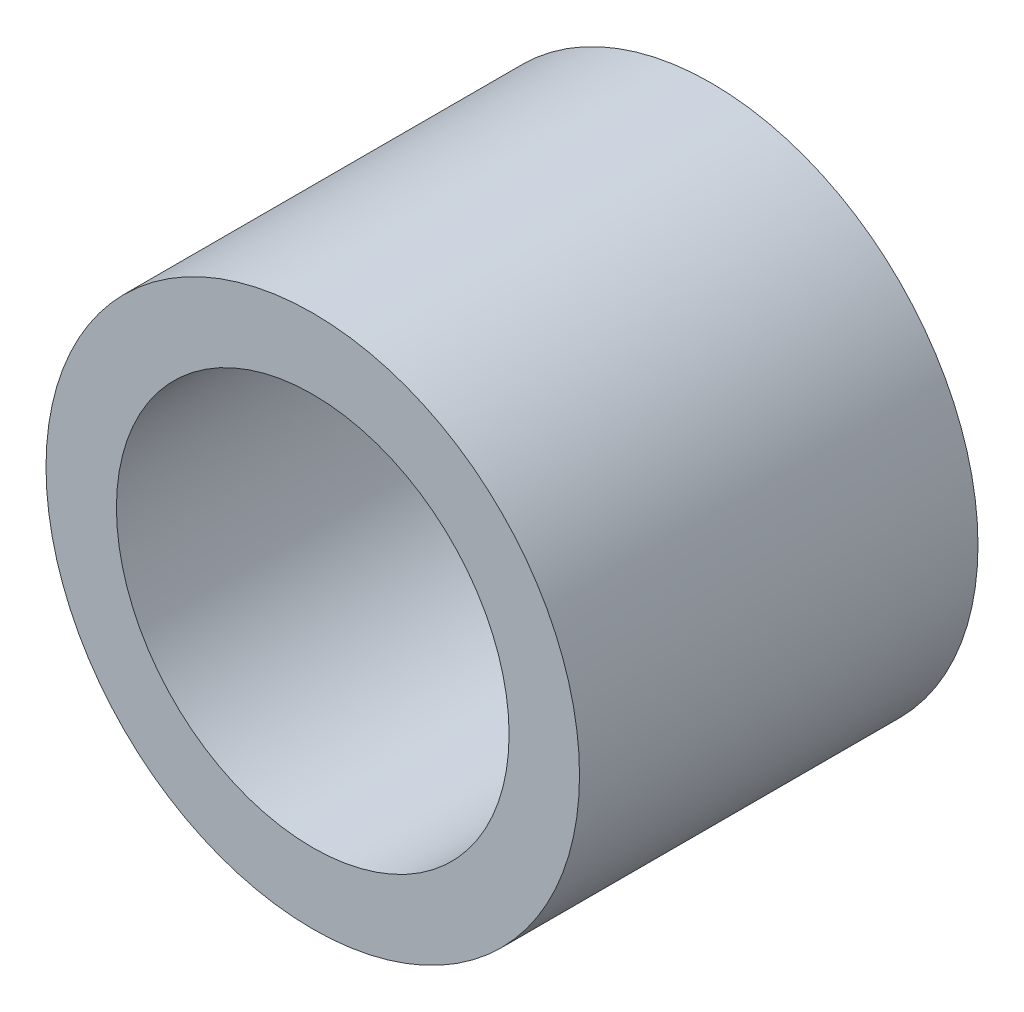
ISO-10303-21;
HEADER;
FILE_DESCRIPTION(('STEP AP214'),'2;1');
FILE_NAME('part.step','',(''),(''),'','','');
FILE_SCHEMA(('AUTOMOTIVE_DESIGN { 1 0 10303 214 1 1 1 1 }'));
ENDSEC;
DATA;
#1=APPLICATION_CONTEXT('core data for automotive mechanical design processes');
#2=APPLICATION_PROTOCOL_DEFINITION('international standard','automotive_design',2000,#1);
#3=PRODUCT_CONTEXT('',#1,'mechanical');
#4=PRODUCT('Part','Part','',(#3));
#5=PRODUCT_RELATED_PRODUCT_CATEGORY('part','',(#4));
#6=PRODUCT_DEFINITION_FORMATION('','',#4);
#7=PRODUCT_DEFINITION_CONTEXT('part definition',#1,'design');
#8=PRODUCT_DEFINITION('design','',#6,#7);
#9=PRODUCT_DEFINITION_SHAPE('','',#8);
#10=(LENGTH_UNIT() NAMED_UNIT(*) SI_UNIT(.MILLI.,.METRE.));
#11=(NAMED_UNIT(*) PLANE_ANGLE_UNIT() SI_UNIT($,.RADIAN.));
#12=(NAMED_UNIT(*) SI_UNIT($,.STERADIAN.) SOLID_ANGLE_UNIT());
#13=UNCERTAINTY_MEASURE_WITH_UNIT(LENGTH_MEASURE(1.E-05),#10,'distance_accuracy_value','');
#14=(GEOMETRIC_REPRESENTATION_CONTEXT(3) GLOBAL_UNCERTAINTY_ASSIGNED_CONTEXT((#13)) GLOBAL_UNIT_ASSIGNED_CONTEXT((#10,
#11,#12)) REPRESENTATION_CONTEXT('',''));
#15=CARTESIAN_POINT('',(0.,0.,0.));
#16=DIRECTION('',(0.,0.,1.));
#17=DIRECTION('',(1.,0.,0.));
#18=AXIS2_PLACEMENT_3D('',#15,#16,#17);
#19=CARTESIAN_POINT('',(0.,0.,24.015448211871));
#20=DIRECTION('',(0.,0.,-1.));
#21=DIRECTION('',(-1.,0.,0.));
#22=AXIS2_PLACEMENT_3D('',#19,#20,#21);
#23=CYLINDRICAL_SURFACE('',#22,5.55625);
#24=CARTESIAN_POINT('',(0.,0.,0.));
#25=DIRECTION('',(0.,0.,1.));
#26=DIRECTION('',(1.,0.,0.));
#27=AXIS2_PLACEMENT_3D('',#24,#25,#26);
#28=CIRCLE('',#27,5.55625);
#29=CARTESIAN_POINT('',(5.55625,0.,0.));
#30=VERTEX_POINT('',#29);
#31=EDGE_CURVE('E42',#30,#30,#28,.T.);
#32=ORIENTED_EDGE('',*,*,#31,.T.);
#33=EDGE_LOOP('',(#32));
#34=FACE_BOUND('',#33,.T.);
#35=CARTESIAN_POINT('',(0.,0.,8.29999999999997));
#36=DIRECTION('',(0.,0.,1.));
#37=DIRECTION('',(1.,0.,0.));
#38=AXIS2_PLACEMENT_3D('',#35,#36,#37);
#39=CIRCLE('',#38,5.55625);
#40=CARTESIAN_POINT('',(5.55625,0.,8.29999999999992));
#41=VERTEX_POINT('',#40);
#42=EDGE_CURVE('E10',#41,#41,#39,.T.);
#43=ORIENTED_EDGE('',*,*,#42,.F.);
#44=EDGE_LOOP('',(#43));
#45=FACE_BOUND('',#44,.T.);
#46=ADVANCED_FACE('F31',(#34,#45),#23,.T.);
#47=CARTESIAN_POINT('',(0.,0.,0.));
#48=DIRECTION('',(0.,0.,1.));
#49=DIRECTION('',(1.,0.,0.));
#50=AXIS2_PLACEMENT_3D('',#47,#48,#49);
#51=PLANE('',#50);
#52=ORIENTED_EDGE('',*,*,#31,.F.);
#53=EDGE_LOOP('',(#52));
#54=FACE_BOUND('',#53,.T.);
#55=CARTESIAN_POINT('',(0.,0.,0.));
#56=DIRECTION('',(0.,0.,1.));
#57=DIRECTION('',(1.,0.,0.));
#58=AXIS2_PLACEMENT_3D('',#55,#56,#57);
#59=CIRCLE('',#58,4.0894);
#60=CARTESIAN_POINT('',(4.0894,0.,0.));
#61=VERTEX_POINT('',#60);
#62=EDGE_CURVE('E44',#61,#61,#59,.T.);
#63=ORIENTED_EDGE('',*,*,#62,.T.);
#64=EDGE_LOOP('',(#63));
#65=FACE_BOUND('',#64,.T.);
#66=ADVANCED_FACE('F51',(#54,#65),#51,.F.);
#67=CARTESIAN_POINT('',(0.,0.,24.015448211871));
#68=DIRECTION('',(0.,0.,-1.));
#69=DIRECTION('',(-1.,0.,0.));
#70=AXIS2_PLACEMENT_3D('',#67,#68,#69);
#71=CYLINDRICAL_SURFACE('',#70,4.0894);
#72=ORIENTED_EDGE('',*,*,#62,.F.);
#73=EDGE_LOOP('',(#72));
#74=FACE_BOUND('',#73,.T.);
#75=CARTESIAN_POINT('',(0.,0.,8.29999999999997));
#76=DIRECTION('',(0.,0.,1.));
#77=DIRECTION('',(1.,0.,0.));
#78=AXIS2_PLACEMENT_3D('',#75,#76,#77);
#79=CIRCLE('',#78,4.0894);
#80=CARTESIAN_POINT('',(4.0894,0.,8.29999999999994));
#81=VERTEX_POINT('',#80);
#82=EDGE_CURVE('E34',#81,#81,#79,.T.);
#83=ORIENTED_EDGE('',*,*,#82,.T.);
#84=EDGE_LOOP('',(#83));
#85=FACE_BOUND('',#84,.T.);
#86=ADVANCED_FACE('F54',(#74,#85),#71,.F.);
#87=CARTESIAN_POINT('',(5.90172550852814,-1.08149712065528,8.29999999999993));
#88=DIRECTION('',(0.,0.,1.));
#89=DIRECTION('',(0.983620918088103,-0.180249520108977,0.));
#90=AXIS2_PLACEMENT_3D('',#87,#88,#89);
#91=PLANE('',#90);
#92=ORIENTED_EDGE('',*,*,#82,.F.);
#93=EDGE_LOOP('',(#92));
#94=FACE_BOUND('',#93,.T.);
#95=ORIENTED_EDGE('',*,*,#42,.T.);
#96=EDGE_LOOP('',(#95));
#97=FACE_BOUND('',#96,.T.);
#98=ADVANCED_FACE('F59',(#94,#97),#91,.T.);
#99=CLOSED_SHELL('',(#46,#66,#86,#98));
#100=MANIFOLD_SOLID_BREP('B2',#99);
#101=ADVANCED_BREP_SHAPE_REPRESENTATION('',(#18,#100),#14);
#102=SHAPE_DEFINITION_REPRESENTATION(#9,#101);
ENDSEC;
END-ISO-10303-21;
